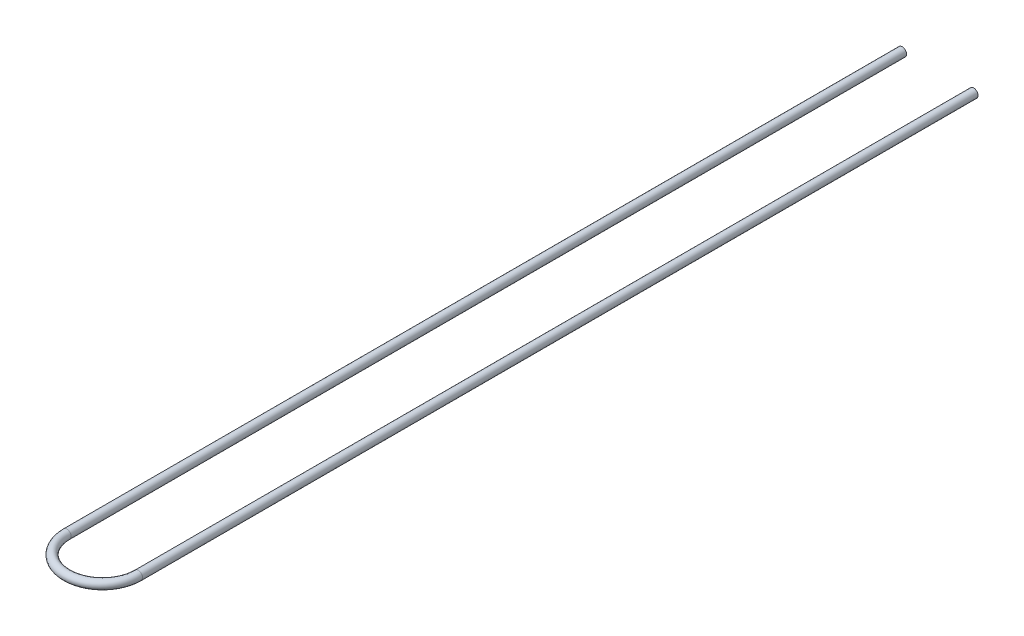
ISO-10303-21;
HEADER;
FILE_DESCRIPTION(('STEP AP214'),'2;1');
FILE_NAME('part.step','',(''),(''),'','','');
FILE_SCHEMA(('AUTOMOTIVE_DESIGN { 1 0 10303 214 1 1 1 1 }'));
ENDSEC;
DATA;
#1=APPLICATION_CONTEXT('core data for automotive mechanical design processes');
#2=APPLICATION_PROTOCOL_DEFINITION('international standard','automotive_design',2000,#1);
#3=PRODUCT_CONTEXT('',#1,'mechanical');
#4=PRODUCT('Part','Part','',(#3));
#5=PRODUCT_RELATED_PRODUCT_CATEGORY('part','',(#4));
#6=PRODUCT_DEFINITION_FORMATION('','',#4);
#7=PRODUCT_DEFINITION_CONTEXT('part definition',#1,'design');
#8=PRODUCT_DEFINITION('design','',#6,#7);
#9=PRODUCT_DEFINITION_SHAPE('','',#8);
#10=(LENGTH_UNIT() NAMED_UNIT(*) SI_UNIT(.MILLI.,.METRE.));
#11=(NAMED_UNIT(*) PLANE_ANGLE_UNIT() SI_UNIT($,.RADIAN.));
#12=(NAMED_UNIT(*) SI_UNIT($,.STERADIAN.) SOLID_ANGLE_UNIT());
#13=UNCERTAINTY_MEASURE_WITH_UNIT(LENGTH_MEASURE(1.E-05),#10,'distance_accuracy_value','');
#14=(GEOMETRIC_REPRESENTATION_CONTEXT(3) GLOBAL_UNCERTAINTY_ASSIGNED_CONTEXT((#13)) GLOBAL_UNIT_ASSIGNED_CONTEXT((#10,
#11,#12)) REPRESENTATION_CONTEXT('',''));
#15=CARTESIAN_POINT('',(0.,0.,0.));
#16=DIRECTION('',(0.,0.,1.));
#17=DIRECTION('',(1.,0.,0.));
#18=AXIS2_PLACEMENT_3D('',#15,#16,#17);
#19=CARTESIAN_POINT('',(-40.,0.,299.999999999999));
#20=DIRECTION('',(0.,0.,1.));
#21=DIRECTION('',(1.,0.,0.));
#22=AXIS2_PLACEMENT_3D('',#19,#20,#21);
#23=CYLINDRICAL_SURFACE('',#22,11.1);
#24=CARTESIAN_POINT('',(-39.9999999999997,0.,2440.));
#25=DIRECTION('',(0.,0.,1.));
#26=DIRECTION('',(1.,0.,0.));
#27=AXIS2_PLACEMENT_3D('',#24,#25,#26);
#28=CIRCLE('',#27,11.1);
#29=CARTESIAN_POINT('',(-51.0999999999997,0.,2440.));
#30=VERTEX_POINT('',#29);
#31=EDGE_CURVE('E54',#30,#30,#28,.T.);
#32=ORIENTED_EDGE('',*,*,#31,.F.);
#33=EDGE_LOOP('',(#32));
#34=FACE_BOUND('',#33,.T.);
#35=CARTESIAN_POINT('',(-40.,0.,299.999999999999));
#36=DIRECTION('',(0.,0.,1.));
#37=DIRECTION('',(1.,0.,0.));
#38=AXIS2_PLACEMENT_3D('',#35,#36,#37);
#39=CIRCLE('',#38,11.1);
#40=CARTESIAN_POINT('',(-28.9,0.,299.999999999999));
#41=VERTEX_POINT('',#40);
#42=EDGE_CURVE('E52',#41,#41,#39,.T.);
#43=ORIENTED_EDGE('',*,*,#42,.T.);
#44=EDGE_LOOP('',(#43));
#45=FACE_BOUND('',#44,.T.);
#46=ADVANCED_FACE('F31',(#34,#45),#23,.T.);
#47=CARTESIAN_POINT('',(51.5400000000003,0.,2440.));
#48=DIRECTION('',(0.,1.,0.));
#49=DIRECTION('',(0.,0.,1.));
#50=AXIS2_PLACEMENT_3D('',#47,#48,#49);
#51=TOROIDAL_SURFACE('',#50,91.54,11.1);
#52=CARTESIAN_POINT('',(143.08,0.,2440.));
#53=DIRECTION('',(0.,0.,-1.));
#54=DIRECTION('',(-1.,0.,0.));
#55=AXIS2_PLACEMENT_3D('',#52,#53,#54);
#56=CIRCLE('',#55,11.1);
#57=CARTESIAN_POINT('',(154.18,0.,2440.));
#58=VERTEX_POINT('',#57);
#59=EDGE_CURVE('E35',#58,#58,#56,.T.);
#60=CARTESIAN_POINT('',(51.5400000000003,0.,2440.));
#61=DIRECTION('',(0.,1.,0.));
#62=DIRECTION('',(0.,0.,1.));
#63=AXIS2_PLACEMENT_3D('',#60,#61,#62);
#64=CIRCLE('',#63,102.64);
#65=EDGE_CURVE('',#30,#58,#64,.T.);
#66=ORIENTED_EDGE('',*,*,#31,.T.);
#67=ORIENTED_EDGE('',*,*,#59,.F.);
#68=ORIENTED_EDGE('',*,*,#65,.T.);
#69=ORIENTED_EDGE('',*,*,#65,.F.);
#70=EDGE_LOOP('',(#66,#68,#67,#69));
#71=FACE_BOUND('',#70,.T.);
#72=ADVANCED_FACE('F62',(#71),#51,.T.);
#73=CARTESIAN_POINT('',(143.08,0.,2440.));
#74=DIRECTION('',(0.,0.,-1.));
#75=DIRECTION('',(-1.,0.,0.));
#76=AXIS2_PLACEMENT_3D('',#73,#74,#75);
#77=CYLINDRICAL_SURFACE('',#76,11.1);
#78=CARTESIAN_POINT('',(143.08,0.,299.999999999999));
#79=DIRECTION('',(0.,0.,-1.));
#80=DIRECTION('',(-1.,0.,0.));
#81=AXIS2_PLACEMENT_3D('',#78,#79,#80);
#82=CIRCLE('',#81,11.1);
#83=CARTESIAN_POINT('',(131.98,0.,299.999999999999));
#84=VERTEX_POINT('',#83);
#85=EDGE_CURVE('E48',#84,#84,#82,.T.);
#86=ORIENTED_EDGE('',*,*,#85,.F.);
#87=EDGE_LOOP('',(#86));
#88=FACE_BOUND('',#87,.T.);
#89=ORIENTED_EDGE('',*,*,#59,.T.);
#90=EDGE_LOOP('',(#89));
#91=FACE_BOUND('',#90,.T.);
#92=ADVANCED_FACE('F33',(#88,#91),#77,.T.);
#93=CARTESIAN_POINT('',(-40.,0.,299.999999999999));
#94=DIRECTION('',(0.,0.,1.));
#95=DIRECTION('',(1.,0.,0.));
#96=AXIS2_PLACEMENT_3D('',#93,#94,#95);
#97=PLANE('',#96);
#98=CARTESIAN_POINT('',(-40.,0.,299.999999999999));
#99=DIRECTION('',(0.,0.,1.));
#100=DIRECTION('',(1.,0.,0.));
#101=AXIS2_PLACEMENT_3D('',#98,#99,#100);
#102=CIRCLE('',#101,9.94999999999998);
#103=CARTESIAN_POINT('',(-30.05,0.,299.999999999999));
#104=VERTEX_POINT('',#103);
#105=EDGE_CURVE('E51',#104,#104,#102,.F.);
#106=ORIENTED_EDGE('',*,*,#105,.F.);
#107=EDGE_LOOP('',(#106));
#108=FACE_BOUND('',#107,.T.);
#109=ORIENTED_EDGE('',*,*,#42,.F.);
#110=EDGE_LOOP('',(#109));
#111=FACE_BOUND('',#110,.T.);
#112=ADVANCED_FACE('F68',(#108,#111),#97,.F.);
#113=CARTESIAN_POINT('',(143.08,0.,299.999999999999));
#114=DIRECTION('',(0.,0.,-1.));
#115=DIRECTION('',(-1.,0.,0.));
#116=AXIS2_PLACEMENT_3D('',#113,#114,#115);
#117=PLANE('',#116);
#118=CARTESIAN_POINT('',(143.08,0.,299.999999999999));
#119=DIRECTION('',(0.,0.,-1.));
#120=DIRECTION('',(-1.,0.,0.));
#121=AXIS2_PLACEMENT_3D('',#118,#119,#120);
#122=CIRCLE('',#121,9.94999999999998);
#123=CARTESIAN_POINT('',(133.13,0.,299.999999999999));
#124=VERTEX_POINT('',#123);
#125=EDGE_CURVE('E10',#124,#124,#122,.F.);
#126=ORIENTED_EDGE('',*,*,#125,.T.);
#127=EDGE_LOOP('',(#126));
#128=FACE_BOUND('',#127,.T.);
#129=ORIENTED_EDGE('',*,*,#85,.T.);
#130=EDGE_LOOP('',(#129));
#131=FACE_BOUND('',#130,.T.);
#132=ADVANCED_FACE('F86',(#128,#131),#117,.T.);
#133=CARTESIAN_POINT('',(-40.,0.,299.999999999999));
#134=DIRECTION('',(0.,0.,1.));
#135=DIRECTION('',(1.,0.,0.));
#136=AXIS2_PLACEMENT_3D('',#133,#134,#135);
#137=CYLINDRICAL_SURFACE('',#136,9.94999999999998);
#138=CARTESIAN_POINT('',(-39.9999999999997,0.,2440.));
#139=DIRECTION('',(0.,0.,1.));
#140=DIRECTION('',(1.,0.,0.));
#141=AXIS2_PLACEMENT_3D('',#138,#139,#140);
#142=CIRCLE('',#141,9.94999999999998);
#143=CARTESIAN_POINT('',(-49.9499999999997,0.,2440.));
#144=VERTEX_POINT('',#143);
#145=EDGE_CURVE('E44',#144,#144,#142,.F.);
#146=ORIENTED_EDGE('',*,*,#145,.F.);
#147=EDGE_LOOP('',(#146));
#148=FACE_BOUND('',#147,.T.);
#149=ORIENTED_EDGE('',*,*,#105,.T.);
#150=EDGE_LOOP('',(#149));
#151=FACE_BOUND('',#150,.T.);
#152=ADVANCED_FACE('F80',(#148,#151),#137,.F.);
#153=CARTESIAN_POINT('',(51.5400000000003,0.,2440.));
#154=DIRECTION('',(0.,1.,0.));
#155=DIRECTION('',(0.,0.,1.));
#156=AXIS2_PLACEMENT_3D('',#153,#154,#155);
#157=TOROIDAL_SURFACE('',#156,91.54,9.94999999999998);
#158=CARTESIAN_POINT('',(143.08,0.,2440.));
#159=DIRECTION('',(0.,0.,-1.));
#160=DIRECTION('',(-1.,0.,0.));
#161=AXIS2_PLACEMENT_3D('',#158,#159,#160);
#162=CIRCLE('',#161,9.94999999999998);
#163=CARTESIAN_POINT('',(153.03,0.,2440.));
#164=VERTEX_POINT('',#163);
#165=EDGE_CURVE('E39',#164,#164,#162,.F.);
#166=CARTESIAN_POINT('',(51.5400000000003,0.,2440.));
#167=DIRECTION('',(0.,1.,0.));
#168=DIRECTION('',(0.,0.,1.));
#169=AXIS2_PLACEMENT_3D('',#166,#167,#168);
#170=CIRCLE('',#169,101.49);
#171=EDGE_CURVE('',#144,#164,#170,.T.);
#172=ORIENTED_EDGE('',*,*,#145,.T.);
#173=ORIENTED_EDGE('',*,*,#165,.F.);
#174=ORIENTED_EDGE('',*,*,#171,.T.);
#175=ORIENTED_EDGE('',*,*,#171,.F.);
#176=EDGE_LOOP('',(#172,#174,#173,#175));
#177=FACE_BOUND('',#176,.T.);
#178=ADVANCED_FACE('F74',(#177),#157,.F.);
#179=CARTESIAN_POINT('',(143.08,0.,2440.));
#180=DIRECTION('',(0.,0.,-1.));
#181=DIRECTION('',(-1.,0.,0.));
#182=AXIS2_PLACEMENT_3D('',#179,#180,#181);
#183=CYLINDRICAL_SURFACE('',#182,9.94999999999998);
#184=ORIENTED_EDGE('',*,*,#125,.F.);
#185=EDGE_LOOP('',(#184));
#186=FACE_BOUND('',#185,.T.);
#187=ORIENTED_EDGE('',*,*,#165,.T.);
#188=EDGE_LOOP('',(#187));
#189=FACE_BOUND('',#188,.T.);
#190=ADVANCED_FACE('F72',(#186,#189),#183,.F.);
#191=CLOSED_SHELL('',(#46,#72,#92,#112,#132,#152,#178,#190));
#192=MANIFOLD_SOLID_BREP('B2',#191);
#193=ADVANCED_BREP_SHAPE_REPRESENTATION('',(#18,#192),#14);
#194=SHAPE_DEFINITION_REPRESENTATION(#9,#193);
ENDSEC;
END-ISO-10303-21;
